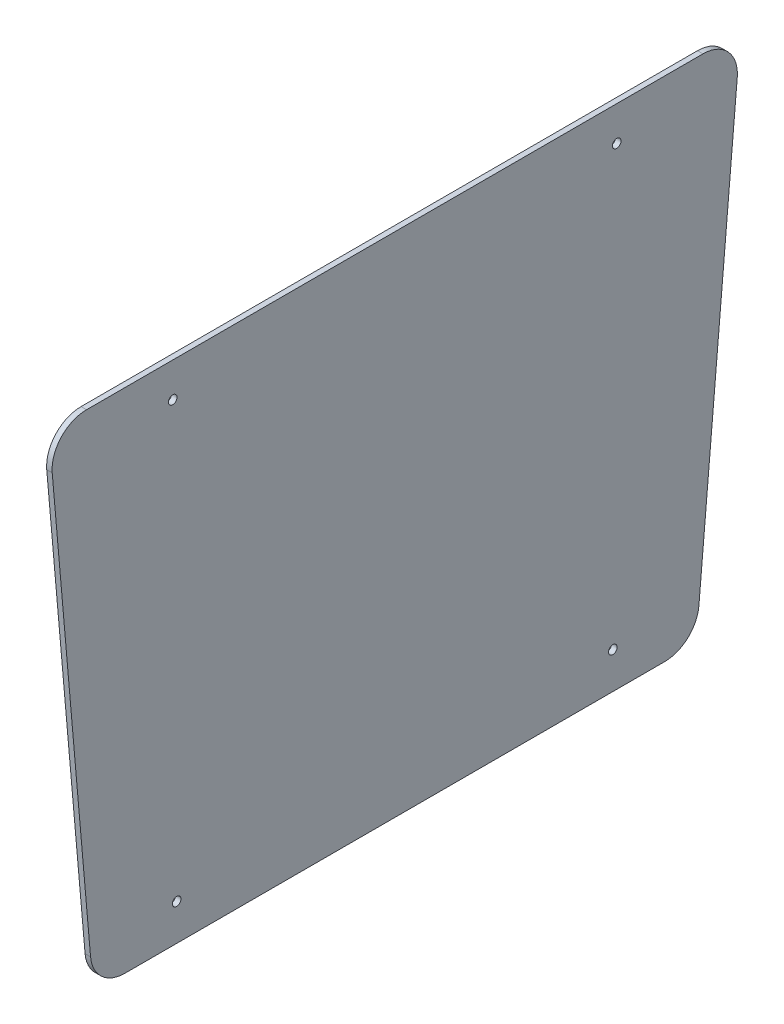
ISO-10303-21;
HEADER;
FILE_DESCRIPTION(('STEP AP214'),'2;1');
FILE_NAME('part.step','',(''),(''),'','','');
FILE_SCHEMA(('AUTOMOTIVE_DESIGN { 1 0 10303 214 1 1 1 1 }'));
ENDSEC;
DATA;
#1=APPLICATION_CONTEXT('core data for automotive mechanical design processes');
#2=APPLICATION_PROTOCOL_DEFINITION('international standard','automotive_design',2000,#1);
#3=PRODUCT_CONTEXT('',#1,'mechanical');
#4=PRODUCT('Part','Part','',(#3));
#5=PRODUCT_RELATED_PRODUCT_CATEGORY('part','',(#4));
#6=PRODUCT_DEFINITION_FORMATION('','',#4);
#7=PRODUCT_DEFINITION_CONTEXT('part definition',#1,'design');
#8=PRODUCT_DEFINITION('design','',#6,#7);
#9=PRODUCT_DEFINITION_SHAPE('','',#8);
#10=(LENGTH_UNIT() NAMED_UNIT(*) SI_UNIT(.MILLI.,.METRE.));
#11=(NAMED_UNIT(*) PLANE_ANGLE_UNIT() SI_UNIT($,.RADIAN.));
#12=(NAMED_UNIT(*) SI_UNIT($,.STERADIAN.) SOLID_ANGLE_UNIT());
#13=UNCERTAINTY_MEASURE_WITH_UNIT(LENGTH_MEASURE(1.E-05),#10,'distance_accuracy_value','');
#14=(GEOMETRIC_REPRESENTATION_CONTEXT(3) GLOBAL_UNCERTAINTY_ASSIGNED_CONTEXT((#13)) GLOBAL_UNIT_ASSIGNED_CONTEXT((#10,
#11,#12)) REPRESENTATION_CONTEXT('',''));
#15=CARTESIAN_POINT('',(0.,0.,0.));
#16=DIRECTION('',(0.,0.,1.));
#17=DIRECTION('',(1.,0.,0.));
#18=AXIS2_PLACEMENT_3D('',#15,#16,#17);
#19=CARTESIAN_POINT('',(-3.175,0.,-350.025677636692));
#20=DIRECTION('',(0.,-1.,0.));
#21=DIRECTION('',(0.,0.,-1.));
#22=AXIS2_PLACEMENT_3D('',#19,#20,#21);
#23=PLANE('',#22);
#24=DIRECTION('',(0.,0.,-1.));
#25=VECTOR('',#24,1.);
#26=CARTESIAN_POINT('',(-3.175,0.,-350.025677636692));
#27=LINE('',#26,#25);
#28=CARTESIAN_POINT('',(-3.175,0.,-18.3266234803485));
#29=VERTEX_POINT('',#28);
#30=CARTESIAN_POINT('',(-3.175,0.,-331.699054156343));
#31=VERTEX_POINT('',#30);
#32=EDGE_CURVE('E160',#29,#31,#27,.T.);
#33=ORIENTED_EDGE('',*,*,#32,.T.);
#34=DIRECTION('',(1.,0.,0.));
#35=VECTOR('',#34,1.);
#36=CARTESIAN_POINT('',(-3.175,0.,-331.699054156343));
#37=LINE('',#36,#35);
#38=CARTESIAN_POINT('',(0.,0.,-331.699054156343));
#39=VERTEX_POINT('',#38);
#40=EDGE_CURVE('E156',#31,#39,#37,.T.);
#41=ORIENTED_EDGE('',*,*,#40,.T.);
#42=DIRECTION('',(0.,0.,-1.));
#43=VECTOR('',#42,1.);
#44=CARTESIAN_POINT('',(0.,0.,-350.025677636692));
#45=LINE('',#44,#43);
#46=CARTESIAN_POINT('',(0.,0.,-18.3266234803485));
#47=VERTEX_POINT('',#46);
#48=EDGE_CURVE('E109',#47,#39,#45,.T.);
#49=ORIENTED_EDGE('',*,*,#48,.F.);
#50=DIRECTION('',(1.,0.,0.));
#51=VECTOR('',#50,1.);
#52=CARTESIAN_POINT('',(-3.175,0.,-18.3266234803485));
#53=LINE('',#52,#51);
#54=EDGE_CURVE('E154',#47,#29,#53,.F.);
#55=ORIENTED_EDGE('',*,*,#54,.T.);
#56=EDGE_LOOP('',(#33,#41,#49,#55));
#57=FACE_BOUND('',#56,.T.);
#58=ADVANCED_FACE('F38',(#57),#23,.T.);
#59=CARTESIAN_POINT('',(-3.175,0.,0.));
#60=DIRECTION('',(0.,-0.087155742747655,0.996194698091746));
#61=DIRECTION('',(0.,-0.996194698091746,-0.087155742747655));
#62=AXIS2_PLACEMENT_3D('',#59,#60,#61);
#63=PLANE('',#62);
#64=DIRECTION('',(0.,-0.996194698091746,-0.087155742747655));
#65=VECTOR('',#64,1.);
#66=CARTESIAN_POINT('',(-3.175,0.,0.));
#67=LINE('',#66,#65);
#68=CARTESIAN_POINT('',(-3.175,272.776885145047,23.8648851221037));
#69=VERTEX_POINT('',#68);
#70=CARTESIAN_POINT('',(-3.175,18.2568851450469,1.59727048148639));
#71=VERTEX_POINT('',#70);
#72=EDGE_CURVE('E130',#69,#71,#67,.T.);
#73=ORIENTED_EDGE('',*,*,#72,.T.);
#74=DIRECTION('',(1.,0.,0.));
#75=VECTOR('',#74,1.);
#76=CARTESIAN_POINT('',(-3.175,18.2568851450469,1.59727048148639));
#77=LINE('',#76,#75);
#78=CARTESIAN_POINT('',(0.,18.2568851450469,1.59727048148639));
#79=VERTEX_POINT('',#78);
#80=EDGE_CURVE('E11',#71,#79,#77,.T.);
#81=ORIENTED_EDGE('',*,*,#80,.T.);
#82=DIRECTION('',(0.,-0.996194698091746,-0.087155742747655));
#83=VECTOR('',#82,1.);
#84=CARTESIAN_POINT('',(0.,0.,0.));
#85=LINE('',#84,#83);
#86=CARTESIAN_POINT('',(0.,272.776885145047,23.8648851221037));
#87=VERTEX_POINT('',#86);
#88=EDGE_CURVE('E137',#87,#79,#85,.T.);
#89=ORIENTED_EDGE('',*,*,#88,.F.);
#90=DIRECTION('',(1.,0.,0.));
#91=VECTOR('',#90,1.);
#92=CARTESIAN_POINT('',(-3.175,272.776885145047,23.8648851221037));
#93=LINE('',#92,#91);
#94=EDGE_CURVE('E46',#87,#69,#93,.F.);
#95=ORIENTED_EDGE('',*,*,#94,.T.);
#96=EDGE_LOOP('',(#73,#81,#89,#95));
#97=FACE_BOUND('',#96,.T.);
#98=ADVANCED_FACE('F196',(#97),#63,.T.);
#99=CARTESIAN_POINT('',(-3.175,294.52,25.7671611816542));
#100=DIRECTION('',(0.,1.,0.));
#101=DIRECTION('',(0.,0.,1.));
#102=AXIS2_PLACEMENT_3D('',#99,#100,#101);
#103=PLANE('',#102);
#104=DIRECTION('',(0.,0.,1.));
#105=VECTOR('',#104,1.);
#106=CARTESIAN_POINT('',(0.,294.52,25.7671611816542));
#107=LINE('',#106,#105);
#108=CARTESIAN_POINT('',(0.,294.52,-353.966668796961));
#109=VERTEX_POINT('',#108);
#110=CARTESIAN_POINT('',(0.,294.52,3.94099116026882));
#111=VERTEX_POINT('',#110);
#112=EDGE_CURVE('E125',#109,#111,#107,.T.);
#113=ORIENTED_EDGE('',*,*,#112,.F.);
#114=DIRECTION('',(1.,0.,0.));
#115=VECTOR('',#114,1.);
#116=CARTESIAN_POINT('',(-3.175,294.52,-353.966668796961));
#117=LINE('',#116,#115);
#118=CARTESIAN_POINT('',(-3.175,294.52,-353.966668796961));
#119=VERTEX_POINT('',#118);
#120=EDGE_CURVE('E146',#109,#119,#117,.F.);
#121=ORIENTED_EDGE('',*,*,#120,.T.);
#122=DIRECTION('',(0.,0.,1.));
#123=VECTOR('',#122,1.);
#124=CARTESIAN_POINT('',(-3.175,294.52,25.7671611816542));
#125=LINE('',#124,#123);
#126=CARTESIAN_POINT('',(-3.175,294.52,3.94099116026882));
#127=VERTEX_POINT('',#126);
#128=EDGE_CURVE('E134',#119,#127,#125,.T.);
#129=ORIENTED_EDGE('',*,*,#128,.T.);
#130=DIRECTION('',(1.,0.,0.));
#131=VECTOR('',#130,1.);
#132=CARTESIAN_POINT('',(-3.175,294.52,3.94099116026882));
#133=LINE('',#132,#131);
#134=EDGE_CURVE('E143',#127,#111,#133,.T.);
#135=ORIENTED_EDGE('',*,*,#134,.T.);
#136=EDGE_LOOP('',(#113,#121,#129,#135));
#137=FACE_BOUND('',#136,.T.);
#138=ADVANCED_FACE('F175',(#137),#103,.T.);
#139=CARTESIAN_POINT('',(-3.175,294.52,-375.792838818346));
#140=DIRECTION('',(0.,-0.0871557427476544,-0.996194698091746));
#141=DIRECTION('',(0.,0.996194698091746,-0.0871557427476544));
#142=AXIS2_PLACEMENT_3D('',#139,#140,#141);
#143=PLANE('',#142);
#144=DIRECTION('',(0.,0.996194698091746,-0.0871557427476544));
#145=VECTOR('',#144,1.);
#146=CARTESIAN_POINT('',(-3.175,294.52,-375.792838818346));
#147=LINE('',#146,#145);
#148=CARTESIAN_POINT('',(-3.175,18.2568851450469,-351.622948118178));
#149=VERTEX_POINT('',#148);
#150=CARTESIAN_POINT('',(-3.175,272.776885145047,-373.890562758795));
#151=VERTEX_POINT('',#150);
#152=EDGE_CURVE('E161',#149,#151,#147,.T.);
#153=ORIENTED_EDGE('',*,*,#152,.T.);
#154=DIRECTION('',(1.,0.,0.));
#155=VECTOR('',#154,1.);
#156=CARTESIAN_POINT('',(-3.175,272.776885145047,-373.890562758795));
#157=LINE('',#156,#155);
#158=CARTESIAN_POINT('',(0.,272.776885145047,-373.890562758795));
#159=VERTEX_POINT('',#158);
#160=EDGE_CURVE('E124',#151,#159,#157,.T.);
#161=ORIENTED_EDGE('',*,*,#160,.T.);
#162=DIRECTION('',(0.,0.996194698091746,-0.0871557427476544));
#163=VECTOR('',#162,1.);
#164=CARTESIAN_POINT('',(0.,294.52,-375.792838818346));
#165=LINE('',#164,#163);
#166=CARTESIAN_POINT('',(0.,18.2568851450469,-351.622948118178));
#167=VERTEX_POINT('',#166);
#168=EDGE_CURVE('E107',#167,#159,#165,.T.);
#169=ORIENTED_EDGE('',*,*,#168,.F.);
#170=DIRECTION('',(1.,0.,0.));
#171=VECTOR('',#170,1.);
#172=CARTESIAN_POINT('',(-3.175,18.2568851450469,-351.622948118178));
#173=LINE('',#172,#171);
#174=EDGE_CURVE('E121',#167,#149,#173,.F.);
#175=ORIENTED_EDGE('',*,*,#174,.T.);
#176=EDGE_LOOP('',(#153,#161,#169,#175));
#177=FACE_BOUND('',#176,.T.);
#178=ADVANCED_FACE('F120',(#177),#143,.T.);
#179=CARTESIAN_POINT('',(-3.175,0.,0.));
#180=DIRECTION('',(-1.,0.,0.));
#181=DIRECTION('',(0.,0.,1.));
#182=AXIS2_PLACEMENT_3D('',#179,#180,#181);
#183=PLANE('',#182);
#184=CARTESIAN_POINT('',(-3.175,274.52,-303.890562758795));
#185=DIRECTION('',(-1.,0.,0.));
#186=DIRECTION('',(0.,0.,1.));
#187=AXIS2_PLACEMENT_3D('',#184,#185,#186);
#188=CIRCLE('',#187,2.50000000000002);
#189=CARTESIAN_POINT('',(-3.175,274.52,-301.390562758795));
#190=VERTEX_POINT('',#189);
#191=EDGE_CURVE('E166',#190,#190,#188,.T.);
#192=ORIENTED_EDGE('',*,*,#191,.F.);
#193=EDGE_LOOP('',(#192));
#194=FACE_BOUND('',#193,.T.);
#195=CARTESIAN_POINT('',(-3.175,21.1187810399999,-48.4027295185136));
#196=DIRECTION('',(-1.,0.,0.));
#197=DIRECTION('',(0.,0.,1.));
#198=AXIS2_PLACEMENT_3D('',#195,#196,#197);
#199=CIRCLE('',#198,2.5);
#200=CARTESIAN_POINT('',(-3.175,21.1187810399999,-45.9027295185136));
#201=VERTEX_POINT('',#200);
#202=EDGE_CURVE('E348',#201,#201,#199,.T.);
#203=ORIENTED_EDGE('',*,*,#202,.F.);
#204=EDGE_LOOP('',(#203));
#205=FACE_BOUND('',#204,.T.);
#206=CARTESIAN_POINT('',(-3.175,21.1187810399999,-301.622948118178));
#207=DIRECTION('',(-1.,0.,0.));
#208=DIRECTION('',(0.,0.,1.));
#209=AXIS2_PLACEMENT_3D('',#206,#207,#208);
#210=CIRCLE('',#209,2.50000000000002);
#211=CARTESIAN_POINT('',(-3.175,21.1187810399999,-299.122948118178));
#212=VERTEX_POINT('',#211);
#213=EDGE_CURVE('E346',#212,#212,#210,.T.);
#214=ORIENTED_EDGE('',*,*,#213,.F.);
#215=EDGE_LOOP('',(#214));
#216=FACE_BOUND('',#215,.T.);
#217=CARTESIAN_POINT('',(-3.175,274.52,-46.113408302375));
#218=DIRECTION('',(-1.,0.,0.));
#219=DIRECTION('',(0.,0.,1.));
#220=AXIS2_PLACEMENT_3D('',#217,#218,#219);
#221=CIRCLE('',#220,2.5);
#222=CARTESIAN_POINT('',(-3.175,274.52,-43.613408302375));
#223=VERTEX_POINT('',#222);
#224=EDGE_CURVE('E337',#223,#223,#221,.T.);
#225=ORIENTED_EDGE('',*,*,#224,.F.);
#226=EDGE_LOOP('',(#225));
#227=FACE_BOUND('',#226,.T.);
#228=ORIENTED_EDGE('',*,*,#128,.F.);
#229=CARTESIAN_POINT('',(-3.175,274.52,-353.966668796961));
#230=DIRECTION('',(-1.,0.,0.));
#231=DIRECTION('',(0.,0.,1.));
#232=AXIS2_PLACEMENT_3D('',#229,#230,#231);
#233=CIRCLE('',#232,20.);
#234=EDGE_CURVE('E152',#119,#151,#233,.T.);
#235=ORIENTED_EDGE('',*,*,#234,.T.);
#236=ORIENTED_EDGE('',*,*,#152,.F.);
#237=CARTESIAN_POINT('',(-3.175,20.,-331.699054156343));
#238=DIRECTION('',(-1.,0.,0.));
#239=DIRECTION('',(0.,0.,1.));
#240=AXIS2_PLACEMENT_3D('',#237,#238,#239);
#241=CIRCLE('',#240,20.);
#242=EDGE_CURVE('E129',#149,#31,#241,.T.);
#243=ORIENTED_EDGE('',*,*,#242,.T.);
#244=ORIENTED_EDGE('',*,*,#32,.F.);
#245=CARTESIAN_POINT('',(-3.175,20.,-18.3266234803485));
#246=DIRECTION('',(-1.,0.,0.));
#247=DIRECTION('',(0.,0.,1.));
#248=AXIS2_PLACEMENT_3D('',#245,#246,#247);
#249=CIRCLE('',#248,20.);
#250=EDGE_CURVE('E53',#29,#71,#249,.T.);
#251=ORIENTED_EDGE('',*,*,#250,.T.);
#252=ORIENTED_EDGE('',*,*,#72,.F.);
#253=CARTESIAN_POINT('',(-3.175,274.52,3.94099116026882));
#254=DIRECTION('',(-1.,0.,0.));
#255=DIRECTION('',(0.,0.,1.));
#256=AXIS2_PLACEMENT_3D('',#253,#254,#255);
#257=CIRCLE('',#256,20.);
#258=EDGE_CURVE('E148',#69,#127,#257,.T.);
#259=ORIENTED_EDGE('',*,*,#258,.T.);
#260=EDGE_LOOP('',(#228,#235,#236,#243,#244,#251,#252,#259));
#261=FACE_BOUND('',#260,.T.);
#262=ADVANCED_FACE('F181',(#194,#205,#216,#227,#261),#183,.T.);
#263=CARTESIAN_POINT('',(0.,0.,0.));
#264=DIRECTION('',(-1.,0.,0.));
#265=DIRECTION('',(0.,0.,1.));
#266=AXIS2_PLACEMENT_3D('',#263,#264,#265);
#267=PLANE('',#266);
#268=CARTESIAN_POINT('',(0.,274.52,-303.890562758795));
#269=DIRECTION('',(1.,0.,0.));
#270=DIRECTION('',(0.,0.,-1.));
#271=AXIS2_PLACEMENT_3D('',#268,#269,#270);
#272=CIRCLE('',#271,2.50000000000002);
#273=CARTESIAN_POINT('',(0.,274.52,-306.390562758795));
#274=VERTEX_POINT('',#273);
#275=EDGE_CURVE('E332',#274,#274,#272,.T.);
#276=ORIENTED_EDGE('',*,*,#275,.F.);
#277=EDGE_LOOP('',(#276));
#278=FACE_BOUND('',#277,.T.);
#279=CARTESIAN_POINT('',(0.,21.1187810399999,-48.4027295185136));
#280=DIRECTION('',(1.,0.,0.));
#281=DIRECTION('',(0.,0.,-1.));
#282=AXIS2_PLACEMENT_3D('',#279,#280,#281);
#283=CIRCLE('',#282,2.5);
#284=CARTESIAN_POINT('',(0.,21.1187810399999,-50.9027295185136));
#285=VERTEX_POINT('',#284);
#286=EDGE_CURVE('E334',#285,#285,#283,.T.);
#287=ORIENTED_EDGE('',*,*,#286,.F.);
#288=EDGE_LOOP('',(#287));
#289=FACE_BOUND('',#288,.T.);
#290=CARTESIAN_POINT('',(0.,21.1187810399999,-301.622948118178));
#291=DIRECTION('',(1.,0.,0.));
#292=DIRECTION('',(0.,0.,-1.));
#293=AXIS2_PLACEMENT_3D('',#290,#291,#292);
#294=CIRCLE('',#293,2.50000000000002);
#295=CARTESIAN_POINT('',(0.,21.1187810399999,-304.122948118178));
#296=VERTEX_POINT('',#295);
#297=EDGE_CURVE('E340',#296,#296,#294,.T.);
#298=ORIENTED_EDGE('',*,*,#297,.F.);
#299=EDGE_LOOP('',(#298));
#300=FACE_BOUND('',#299,.T.);
#301=CARTESIAN_POINT('',(0.,274.52,-46.113408302375));
#302=DIRECTION('',(1.,0.,0.));
#303=DIRECTION('',(0.,0.,-1.));
#304=AXIS2_PLACEMENT_3D('',#301,#302,#303);
#305=CIRCLE('',#304,2.5);
#306=CARTESIAN_POINT('',(0.,274.52,-48.613408302375));
#307=VERTEX_POINT('',#306);
#308=EDGE_CURVE('E333',#307,#307,#305,.T.);
#309=ORIENTED_EDGE('',*,*,#308,.F.);
#310=EDGE_LOOP('',(#309));
#311=FACE_BOUND('',#310,.T.);
#312=ORIENTED_EDGE('',*,*,#168,.T.);
#313=CARTESIAN_POINT('',(0.,274.52,-353.966668796961));
#314=DIRECTION('',(-1.,0.,0.));
#315=DIRECTION('',(0.,0.,1.));
#316=AXIS2_PLACEMENT_3D('',#313,#314,#315);
#317=CIRCLE('',#316,20.);
#318=EDGE_CURVE('E114',#159,#109,#317,.F.);
#319=ORIENTED_EDGE('',*,*,#318,.T.);
#320=ORIENTED_EDGE('',*,*,#112,.T.);
#321=CARTESIAN_POINT('',(0.,274.52,3.94099116026882));
#322=DIRECTION('',(-1.,0.,0.));
#323=DIRECTION('',(0.,0.,1.));
#324=AXIS2_PLACEMENT_3D('',#321,#322,#323);
#325=CIRCLE('',#324,20.);
#326=EDGE_CURVE('E132',#111,#87,#325,.F.);
#327=ORIENTED_EDGE('',*,*,#326,.T.);
#328=ORIENTED_EDGE('',*,*,#88,.T.);
#329=CARTESIAN_POINT('',(0.,20.,-18.3266234803485));
#330=DIRECTION('',(-1.,0.,0.));
#331=DIRECTION('',(0.,0.,1.));
#332=AXIS2_PLACEMENT_3D('',#329,#330,#331);
#333=CIRCLE('',#332,20.);
#334=EDGE_CURVE('E115',#79,#47,#333,.F.);
#335=ORIENTED_EDGE('',*,*,#334,.T.);
#336=ORIENTED_EDGE('',*,*,#48,.T.);
#337=CARTESIAN_POINT('',(0.,20.,-331.699054156343));
#338=DIRECTION('',(-1.,0.,0.));
#339=DIRECTION('',(0.,0.,1.));
#340=AXIS2_PLACEMENT_3D('',#337,#338,#339);
#341=CIRCLE('',#340,20.);
#342=EDGE_CURVE('E104',#39,#167,#341,.F.);
#343=ORIENTED_EDGE('',*,*,#342,.T.);
#344=EDGE_LOOP('',(#312,#319,#320,#327,#328,#335,#336,#343));
#345=FACE_BOUND('',#344,.T.);
#346=ADVANCED_FACE('F106',(#278,#289,#300,#311,#345),#267,.F.);
#347=CARTESIAN_POINT('',(-3.175,274.52,-353.966668796961));
#348=DIRECTION('',(1.,0.,0.));
#349=DIRECTION('',(0.,0.,-1.));
#350=AXIS2_PLACEMENT_3D('',#347,#348,#349);
#351=CYLINDRICAL_SURFACE('',#350,20.);
#352=ORIENTED_EDGE('',*,*,#234,.F.);
#353=ORIENTED_EDGE('',*,*,#120,.F.);
#354=ORIENTED_EDGE('',*,*,#318,.F.);
#355=ORIENTED_EDGE('',*,*,#160,.F.);
#356=EDGE_LOOP('',(#352,#353,#354,#355));
#357=FACE_BOUND('',#356,.T.);
#358=ADVANCED_FACE('F180',(#357),#351,.T.);
#359=CARTESIAN_POINT('',(-3.175,20.,-331.699054156343));
#360=DIRECTION('',(1.,0.,0.));
#361=DIRECTION('',(0.,0.,-1.));
#362=AXIS2_PLACEMENT_3D('',#359,#360,#361);
#363=CYLINDRICAL_SURFACE('',#362,20.);
#364=ORIENTED_EDGE('',*,*,#242,.F.);
#365=ORIENTED_EDGE('',*,*,#174,.F.);
#366=ORIENTED_EDGE('',*,*,#342,.F.);
#367=ORIENTED_EDGE('',*,*,#40,.F.);
#368=EDGE_LOOP('',(#364,#365,#366,#367));
#369=FACE_BOUND('',#368,.T.);
#370=ADVANCED_FACE('F128',(#369),#363,.T.);
#371=CARTESIAN_POINT('',(-3.175,20.,-18.3266234803485));
#372=DIRECTION('',(1.,0.,0.));
#373=DIRECTION('',(0.,0.,-1.));
#374=AXIS2_PLACEMENT_3D('',#371,#372,#373);
#375=CYLINDRICAL_SURFACE('',#374,20.);
#376=ORIENTED_EDGE('',*,*,#250,.F.);
#377=ORIENTED_EDGE('',*,*,#54,.F.);
#378=ORIENTED_EDGE('',*,*,#334,.F.);
#379=ORIENTED_EDGE('',*,*,#80,.F.);
#380=EDGE_LOOP('',(#376,#377,#378,#379));
#381=FACE_BOUND('',#380,.T.);
#382=ADVANCED_FACE('F186',(#381),#375,.T.);
#383=CARTESIAN_POINT('',(-3.175,274.52,3.94099116026882));
#384=DIRECTION('',(1.,0.,0.));
#385=DIRECTION('',(0.,0.,-1.));
#386=AXIS2_PLACEMENT_3D('',#383,#384,#385);
#387=CYLINDRICAL_SURFACE('',#386,20.);
#388=ORIENTED_EDGE('',*,*,#258,.F.);
#389=ORIENTED_EDGE('',*,*,#94,.F.);
#390=ORIENTED_EDGE('',*,*,#326,.F.);
#391=ORIENTED_EDGE('',*,*,#134,.F.);
#392=EDGE_LOOP('',(#388,#389,#390,#391));
#393=FACE_BOUND('',#392,.T.);
#394=ADVANCED_FACE('F40',(#393),#387,.T.);
#395=CARTESIAN_POINT('',(-10.,274.52,-46.113408302375));
#396=DIRECTION('',(1.,0.,0.));
#397=DIRECTION('',(0.,0.,-1.));
#398=AXIS2_PLACEMENT_3D('',#395,#396,#397);
#399=CYLINDRICAL_SURFACE('',#398,2.5);
#400=ORIENTED_EDGE('',*,*,#224,.T.);
#401=EDGE_LOOP('',(#400));
#402=FACE_BOUND('',#401,.T.);
#403=ORIENTED_EDGE('',*,*,#308,.T.);
#404=EDGE_LOOP('',(#403));
#405=FACE_BOUND('',#404,.T.);
#406=ADVANCED_FACE('F185',(#402,#405),#399,.F.);
#407=CARTESIAN_POINT('',(-10.,21.1187810399999,-301.622948118178));
#408=DIRECTION('',(1.,0.,0.));
#409=DIRECTION('',(0.,0.,-1.));
#410=AXIS2_PLACEMENT_3D('',#407,#408,#409);
#411=CYLINDRICAL_SURFACE('',#410,2.50000000000002);
#412=ORIENTED_EDGE('',*,*,#213,.T.);
#413=EDGE_LOOP('',(#412));
#414=FACE_BOUND('',#413,.T.);
#415=ORIENTED_EDGE('',*,*,#297,.T.);
#416=EDGE_LOOP('',(#415));
#417=FACE_BOUND('',#416,.T.);
#418=ADVANCED_FACE('F191',(#414,#417),#411,.F.);
#419=CARTESIAN_POINT('',(-10.,21.1187810399999,-48.4027295185136));
#420=DIRECTION('',(1.,0.,0.));
#421=DIRECTION('',(0.,0.,-1.));
#422=AXIS2_PLACEMENT_3D('',#419,#420,#421);
#423=CYLINDRICAL_SURFACE('',#422,2.5);
#424=ORIENTED_EDGE('',*,*,#202,.T.);
#425=EDGE_LOOP('',(#424));
#426=FACE_BOUND('',#425,.T.);
#427=ORIENTED_EDGE('',*,*,#286,.T.);
#428=EDGE_LOOP('',(#427));
#429=FACE_BOUND('',#428,.T.);
#430=ADVANCED_FACE('F259',(#426,#429),#423,.F.);
#431=CARTESIAN_POINT('',(-10.,274.52,-303.890562758795));
#432=DIRECTION('',(1.,0.,0.));
#433=DIRECTION('',(0.,0.,-1.));
#434=AXIS2_PLACEMENT_3D('',#431,#432,#433);
#435=CYLINDRICAL_SURFACE('',#434,2.50000000000002);
#436=ORIENTED_EDGE('',*,*,#191,.T.);
#437=EDGE_LOOP('',(#436));
#438=FACE_BOUND('',#437,.T.);
#439=ORIENTED_EDGE('',*,*,#275,.T.);
#440=EDGE_LOOP('',(#439));
#441=FACE_BOUND('',#440,.T.);
#442=ADVANCED_FACE('F270',(#438,#441),#435,.F.);
#443=CLOSED_SHELL('',(#58,#98,#138,#178,#262,#346,#358,#370,#382,#394,#406,#418,#430,#442));
#444=MANIFOLD_SOLID_BREP('B2',#443);
#445=ADVANCED_BREP_SHAPE_REPRESENTATION('',(#18,#444),#14);
#446=SHAPE_DEFINITION_REPRESENTATION(#9,#445);
ENDSEC;
END-ISO-10303-21;
